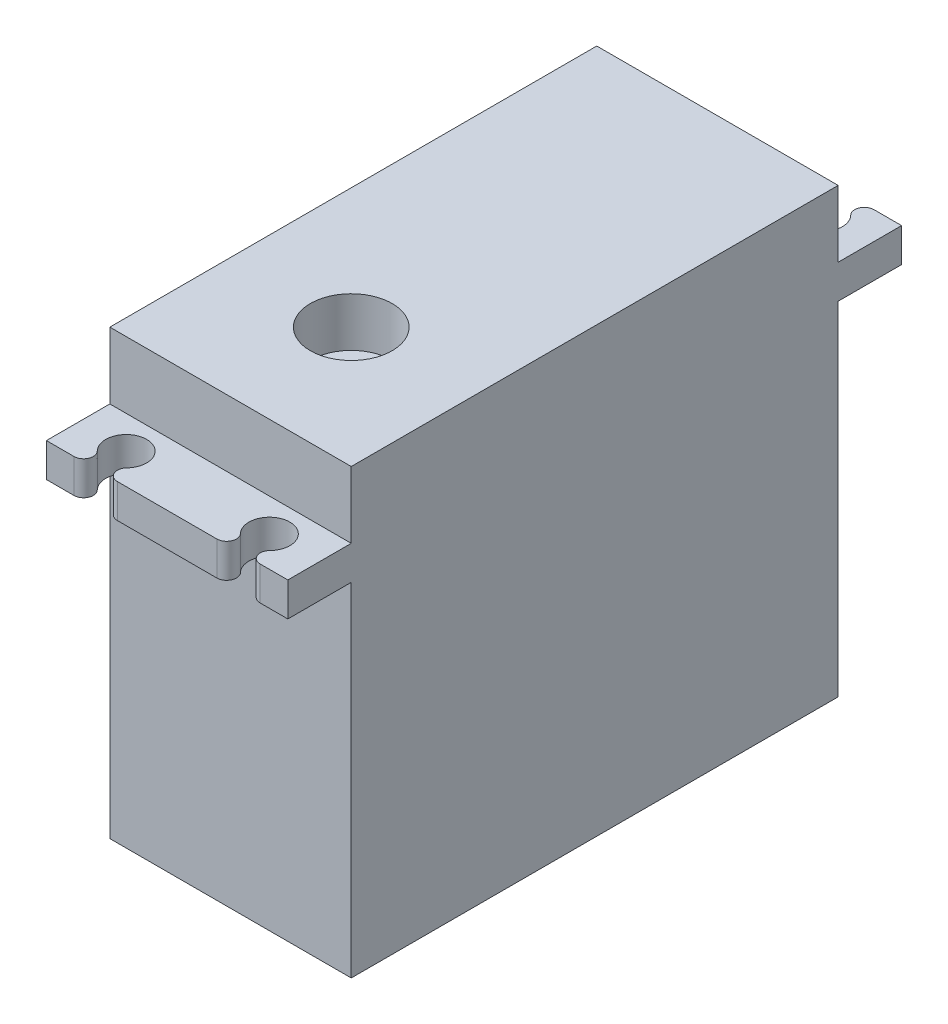
ISO-10303-21;
HEADER;
FILE_DESCRIPTION(('STEP AP214'),'2;1');
FILE_NAME('part.step','',(''),(''),'','','');
FILE_SCHEMA(('AUTOMOTIVE_DESIGN { 1 0 10303 214 1 1 1 1 }'));
ENDSEC;
DATA;
#1=APPLICATION_CONTEXT('core data for automotive mechanical design processes');
#2=APPLICATION_PROTOCOL_DEFINITION('international standard','automotive_design',2000,#1);
#3=PRODUCT_CONTEXT('',#1,'mechanical');
#4=PRODUCT('Part','Part','',(#3));
#5=PRODUCT_RELATED_PRODUCT_CATEGORY('part','',(#4));
#6=PRODUCT_DEFINITION_FORMATION('','',#4);
#7=PRODUCT_DEFINITION_CONTEXT('part definition',#1,'design');
#8=PRODUCT_DEFINITION('design','',#6,#7);
#9=PRODUCT_DEFINITION_SHAPE('','',#8);
#10=(LENGTH_UNIT() NAMED_UNIT(*) SI_UNIT(.MILLI.,.METRE.));
#11=(NAMED_UNIT(*) PLANE_ANGLE_UNIT() SI_UNIT($,.RADIAN.));
#12=(NAMED_UNIT(*) SI_UNIT($,.STERADIAN.) SOLID_ANGLE_UNIT());
#13=UNCERTAINTY_MEASURE_WITH_UNIT(LENGTH_MEASURE(1.E-05),#10,'distance_accuracy_value','');
#14=(GEOMETRIC_REPRESENTATION_CONTEXT(3) GLOBAL_UNCERTAINTY_ASSIGNED_CONTEXT((#13)) GLOBAL_UNIT_ASSIGNED_CONTEXT((#10,
#11,#12)) REPRESENTATION_CONTEXT('',''));
#15=CARTESIAN_POINT('',(0.,0.,0.));
#16=DIRECTION('',(0.,0.,1.));
#17=DIRECTION('',(1.,0.,0.));
#18=AXIS2_PLACEMENT_3D('',#15,#16,#17);
#19=CARTESIAN_POINT('',(0.,0.,-37.5));
#20=DIRECTION('',(0.,0.,1.));
#21=DIRECTION('',(-1.,0.,0.));
#22=AXIS2_PLACEMENT_3D('',#19,#20,#21);
#23=PLANE('',#22);
#24=DIRECTION('',(0.,1.,0.));
#25=VECTOR('',#24,1.);
#26=CARTESIAN_POINT('',(-11.3759671582877,-0.00102500000000172,-37.5));
#27=LINE('',#26,#25);
#28=CARTESIAN_POINT('',(-11.3759671582877,41.87,-37.5));
#29=VERTEX_POINT('',#28);
#30=CARTESIAN_POINT('',(-11.3759671582877,46.,-37.5));
#31=VERTEX_POINT('',#30);
#32=EDGE_CURVE('E239',#29,#31,#27,.T.);
#33=ORIENTED_EDGE('',*,*,#32,.F.);
#34=DIRECTION('',(1.,0.,0.));
#35=VECTOR('',#34,1.);
#36=CARTESIAN_POINT('',(-14.75,41.87,-37.5));
#37=LINE('',#36,#35);
#38=CARTESIAN_POINT('',(-14.75,41.87,-37.5));
#39=VERTEX_POINT('',#38);
#40=EDGE_CURVE('E244',#39,#29,#37,.T.);
#41=ORIENTED_EDGE('',*,*,#40,.F.);
#42=DIRECTION('',(0.,1.,0.));
#43=VECTOR('',#42,1.);
#44=CARTESIAN_POINT('',(-14.75,41.87,-37.5));
#45=LINE('',#44,#43);
#46=CARTESIAN_POINT('',(-14.75,46.,-37.5));
#47=VERTEX_POINT('',#46);
#48=EDGE_CURVE('E285',#39,#47,#45,.T.);
#49=ORIENTED_EDGE('',*,*,#48,.T.);
#50=DIRECTION('',(1.,0.,0.));
#51=VECTOR('',#50,1.);
#52=CARTESIAN_POINT('',(-14.75,46.,-37.5));
#53=LINE('',#52,#51);
#54=EDGE_CURVE('E296',#47,#31,#53,.T.);
#55=ORIENTED_EDGE('',*,*,#54,.T.);
#56=EDGE_LOOP('',(#33,#41,#49,#55));
#57=FACE_BOUND('',#56,.T.);
#58=ADVANCED_FACE('F35',(#57),#23,.F.);
#59=CARTESIAN_POINT('',(-6.079499649266,41.87,-37.5));
#60=VERTEX_POINT('',#59);
#61=CARTESIAN_POINT('',(6.079499649266,41.87,-37.5));
#62=VERTEX_POINT('',#61);
#63=EDGE_CURVE('E292',#60,#62,#37,.T.);
#64=ORIENTED_EDGE('',*,*,#63,.F.);
#65=DIRECTION('',(0.,1.,0.));
#66=VECTOR('',#65,1.);
#67=CARTESIAN_POINT('',(-6.079499649266,-0.00102500000000172,-37.5));
#68=LINE('',#67,#66);
#69=CARTESIAN_POINT('',(-6.079499649266,46.,-37.5));
#70=VERTEX_POINT('',#69);
#71=EDGE_CURVE('E256',#60,#70,#68,.T.);
#72=ORIENTED_EDGE('',*,*,#71,.T.);
#73=CARTESIAN_POINT('',(6.079499649266,46.,-37.5));
#74=VERTEX_POINT('',#73);
#75=EDGE_CURVE('E300',#70,#74,#53,.T.);
#76=ORIENTED_EDGE('',*,*,#75,.T.);
#77=DIRECTION('',(0.,1.,0.));
#78=VECTOR('',#77,1.);
#79=CARTESIAN_POINT('',(6.079499649266,-0.00102500000000172,-37.5));
#80=LINE('',#79,#78);
#81=EDGE_CURVE('E273',#62,#74,#80,.T.);
#82=ORIENTED_EDGE('',*,*,#81,.F.);
#83=EDGE_LOOP('',(#64,#72,#76,#82));
#84=FACE_BOUND('',#83,.T.);
#85=ADVANCED_FACE('F552',(#84),#23,.F.);
#86=CARTESIAN_POINT('',(-14.75,54.13,-29.75));
#87=DIRECTION('',(0.,0.,1.));
#88=DIRECTION('',(1.,0.,0.));
#89=AXIS2_PLACEMENT_3D('',#86,#87,#88);
#90=PLANE('',#89);
#91=DIRECTION('',(1.,0.,0.));
#92=VECTOR('',#91,1.);
#93=CARTESIAN_POINT('',(-14.75,46.,-29.75));
#94=LINE('',#93,#92);
#95=CARTESIAN_POINT('',(-14.75,46.,-29.75));
#96=VERTEX_POINT('',#95);
#97=CARTESIAN_POINT('',(14.75,46.,-29.75));
#98=VERTEX_POINT('',#97);
#99=EDGE_CURVE('E289',#96,#98,#94,.T.);
#100=ORIENTED_EDGE('',*,*,#99,.F.);
#101=DIRECTION('',(0.,-1.,0.));
#102=VECTOR('',#101,1.);
#103=CARTESIAN_POINT('',(-14.75,54.13,-29.75));
#104=LINE('',#103,#102);
#105=CARTESIAN_POINT('',(-14.75,54.13,-29.75));
#106=VERTEX_POINT('',#105);
#107=EDGE_CURVE('E331',#106,#96,#104,.T.);
#108=ORIENTED_EDGE('',*,*,#107,.F.);
#109=DIRECTION('',(-1.,0.,0.));
#110=VECTOR('',#109,1.);
#111=CARTESIAN_POINT('',(-14.75,54.13,-29.75));
#112=LINE('',#111,#110);
#113=CARTESIAN_POINT('',(14.75,54.13,-29.75));
#114=VERTEX_POINT('',#113);
#115=EDGE_CURVE('E383',#114,#106,#112,.T.);
#116=ORIENTED_EDGE('',*,*,#115,.F.);
#117=DIRECTION('',(0.,-1.,0.));
#118=VECTOR('',#117,1.);
#119=CARTESIAN_POINT('',(14.75,54.13,-29.75));
#120=LINE('',#119,#118);
#121=EDGE_CURVE('E11',#114,#98,#120,.T.);
#122=ORIENTED_EDGE('',*,*,#121,.T.);
#123=EDGE_LOOP('',(#100,#108,#116,#122));
#124=FACE_BOUND('',#123,.T.);
#125=ADVANCED_FACE('F559',(#124),#90,.F.);
#126=CARTESIAN_POINT('',(0.,0.,37.5));
#127=DIRECTION('',(0.,0.,-1.));
#128=DIRECTION('',(-1.,0.,0.));
#129=AXIS2_PLACEMENT_3D('',#126,#127,#128);
#130=PLANE('',#129);
#131=DIRECTION('',(0.,1.,0.));
#132=VECTOR('',#131,1.);
#133=CARTESIAN_POINT('',(-11.3759671582877,-0.00102500000000172,37.5));
#134=LINE('',#133,#132);
#135=CARTESIAN_POINT('',(-11.3759671582877,41.87,37.5));
#136=VERTEX_POINT('',#135);
#137=CARTESIAN_POINT('',(-11.3759671582877,46.,37.5));
#138=VERTEX_POINT('',#137);
#139=EDGE_CURVE('E472',#136,#138,#134,.T.);
#140=ORIENTED_EDGE('',*,*,#139,.T.);
#141=DIRECTION('',(1.,0.,0.));
#142=VECTOR('',#141,1.);
#143=CARTESIAN_POINT('',(-14.75,46.,37.5));
#144=LINE('',#143,#142);
#145=CARTESIAN_POINT('',(-14.75,46.,37.5));
#146=VERTEX_POINT('',#145);
#147=EDGE_CURVE('E442',#146,#138,#144,.T.);
#148=ORIENTED_EDGE('',*,*,#147,.F.);
#149=DIRECTION('',(0.,1.,0.));
#150=VECTOR('',#149,1.);
#151=CARTESIAN_POINT('',(-14.75,41.87,37.5));
#152=LINE('',#151,#150);
#153=CARTESIAN_POINT('',(-14.75,41.87,37.5));
#154=VERTEX_POINT('',#153);
#155=EDGE_CURVE('E412',#154,#146,#152,.T.);
#156=ORIENTED_EDGE('',*,*,#155,.F.);
#157=DIRECTION('',(1.,0.,0.));
#158=VECTOR('',#157,1.);
#159=CARTESIAN_POINT('',(-14.75,41.87,37.5));
#160=LINE('',#159,#158);
#161=EDGE_CURVE('E429',#154,#136,#160,.T.);
#162=ORIENTED_EDGE('',*,*,#161,.T.);
#163=EDGE_LOOP('',(#140,#148,#156,#162));
#164=FACE_BOUND('',#163,.T.);
#165=ADVANCED_FACE('F535',(#164),#130,.F.);
#166=CARTESIAN_POINT('',(-6.079499649266,46.,37.5));
#167=VERTEX_POINT('',#166);
#168=CARTESIAN_POINT('',(6.079499649266,46.,37.5));
#169=VERTEX_POINT('',#168);
#170=EDGE_CURVE('E444',#167,#169,#144,.T.);
#171=ORIENTED_EDGE('',*,*,#170,.F.);
#172=DIRECTION('',(0.,1.,0.));
#173=VECTOR('',#172,1.);
#174=CARTESIAN_POINT('',(-6.079499649266,-0.00102500000000172,37.5));
#175=LINE('',#174,#173);
#176=CARTESIAN_POINT('',(-6.079499649266,41.87,37.5));
#177=VERTEX_POINT('',#176);
#178=EDGE_CURVE('E475',#177,#167,#175,.T.);
#179=ORIENTED_EDGE('',*,*,#178,.F.);
#180=CARTESIAN_POINT('',(6.079499649266,41.87,37.5));
#181=VERTEX_POINT('',#180);
#182=EDGE_CURVE('E437',#177,#181,#160,.T.);
#183=ORIENTED_EDGE('',*,*,#182,.T.);
#184=DIRECTION('',(0.,1.,0.));
#185=VECTOR('',#184,1.);
#186=CARTESIAN_POINT('',(6.079499649266,-0.00102500000000172,37.5));
#187=LINE('',#186,#185);
#188=EDGE_CURVE('E446',#181,#169,#187,.T.);
#189=ORIENTED_EDGE('',*,*,#188,.T.);
#190=EDGE_LOOP('',(#171,#179,#183,#189));
#191=FACE_BOUND('',#190,.T.);
#192=ADVANCED_FACE('F501',(#191),#130,.F.);
#193=CARTESIAN_POINT('',(-14.75,54.13,29.75));
#194=DIRECTION('',(0.,0.,-1.));
#195=DIRECTION('',(-1.,0.,0.));
#196=AXIS2_PLACEMENT_3D('',#193,#194,#195);
#197=PLANE('',#196);
#198=DIRECTION('',(1.,0.,0.));
#199=VECTOR('',#198,1.);
#200=CARTESIAN_POINT('',(-14.75,41.87,29.75));
#201=LINE('',#200,#199);
#202=CARTESIAN_POINT('',(-14.75,41.87,29.75));
#203=VERTEX_POINT('',#202);
#204=CARTESIAN_POINT('',(14.75,41.87,29.75));
#205=VERTEX_POINT('',#204);
#206=EDGE_CURVE('E369',#203,#205,#201,.T.);
#207=ORIENTED_EDGE('',*,*,#206,.F.);
#208=DIRECTION('',(0.,-1.,0.));
#209=VECTOR('',#208,1.);
#210=CARTESIAN_POINT('',(-14.75,54.13,29.75));
#211=LINE('',#210,#209);
#212=CARTESIAN_POINT('',(-14.75,0.,29.75));
#213=VERTEX_POINT('',#212);
#214=EDGE_CURVE('E343',#203,#213,#211,.T.);
#215=ORIENTED_EDGE('',*,*,#214,.T.);
#216=DIRECTION('',(1.,0.,0.));
#217=VECTOR('',#216,1.);
#218=CARTESIAN_POINT('',(-14.75,0.,29.75));
#219=LINE('',#218,#217);
#220=CARTESIAN_POINT('',(14.75,0.,29.75));
#221=VERTEX_POINT('',#220);
#222=EDGE_CURVE('E348',#213,#221,#219,.T.);
#223=ORIENTED_EDGE('',*,*,#222,.T.);
#224=DIRECTION('',(0.,-1.,0.));
#225=VECTOR('',#224,1.);
#226=CARTESIAN_POINT('',(14.75,54.13,29.75));
#227=LINE('',#226,#225);
#228=EDGE_CURVE('E344',#205,#221,#227,.T.);
#229=ORIENTED_EDGE('',*,*,#228,.F.);
#230=EDGE_LOOP('',(#207,#215,#223,#229));
#231=FACE_BOUND('',#230,.T.);
#232=ADVANCED_FACE('F365',(#231),#197,.F.);
#233=CARTESIAN_POINT('',(14.75,54.13,29.75));
#234=DIRECTION('',(-1.,0.,0.));
#235=DIRECTION('',(0.,0.,1.));
#236=AXIS2_PLACEMENT_3D('',#233,#234,#235);
#237=PLANE('',#236);
#238=DIRECTION('',(0.,0.,-1.));
#239=VECTOR('',#238,1.);
#240=CARTESIAN_POINT('',(14.75,0.,29.75));
#241=LINE('',#240,#239);
#242=CARTESIAN_POINT('',(14.75,0.,-29.75));
#243=VERTEX_POINT('',#242);
#244=EDGE_CURVE('E380',#221,#243,#241,.T.);
#245=ORIENTED_EDGE('',*,*,#244,.T.);
#246=CARTESIAN_POINT('',(14.75,41.87,-29.75));
#247=VERTEX_POINT('',#246);
#248=EDGE_CURVE('E44',#247,#243,#120,.T.);
#249=ORIENTED_EDGE('',*,*,#248,.F.);
#250=DIRECTION('',(0.,0.,1.));
#251=VECTOR('',#250,1.);
#252=CARTESIAN_POINT('',(14.75,41.87,-37.5));
#253=LINE('',#252,#251);
#254=CARTESIAN_POINT('',(14.75,41.87,-37.5));
#255=VERTEX_POINT('',#254);
#256=EDGE_CURVE('E309',#255,#247,#253,.T.);
#257=ORIENTED_EDGE('',*,*,#256,.F.);
#258=DIRECTION('',(0.,1.,0.));
#259=VECTOR('',#258,1.);
#260=CARTESIAN_POINT('',(14.75,41.87,-37.5));
#261=LINE('',#260,#259);
#262=CARTESIAN_POINT('',(14.75,46.,-37.5));
#263=VERTEX_POINT('',#262);
#264=EDGE_CURVE('E291',#255,#263,#261,.T.);
#265=ORIENTED_EDGE('',*,*,#264,.T.);
#266=DIRECTION('',(0.,0.,1.));
#267=VECTOR('',#266,1.);
#268=CARTESIAN_POINT('',(14.75,46.,-37.5));
#269=LINE('',#268,#267);
#270=EDGE_CURVE('E311',#263,#98,#269,.T.);
#271=ORIENTED_EDGE('',*,*,#270,.T.);
#272=ORIENTED_EDGE('',*,*,#121,.F.);
#273=DIRECTION('',(0.,0.,-1.));
#274=VECTOR('',#273,1.);
#275=CARTESIAN_POINT('',(14.75,54.13,29.75));
#276=LINE('',#275,#274);
#277=CARTESIAN_POINT('',(14.75,54.13,29.75));
#278=VERTEX_POINT('',#277);
#279=EDGE_CURVE('E381',#278,#114,#276,.T.);
#280=ORIENTED_EDGE('',*,*,#279,.F.);
#281=CARTESIAN_POINT('',(14.75,46.,29.75));
#282=VERTEX_POINT('',#281);
#283=EDGE_CURVE('E338',#278,#282,#227,.T.);
#284=ORIENTED_EDGE('',*,*,#283,.T.);
#285=DIRECTION('',(0.,0.,-1.));
#286=VECTOR('',#285,1.);
#287=CARTESIAN_POINT('',(14.75,46.,37.5));
#288=LINE('',#287,#286);
#289=CARTESIAN_POINT('',(14.75,46.,37.5));
#290=VERTEX_POINT('',#289);
#291=EDGE_CURVE('E421',#290,#282,#288,.T.);
#292=ORIENTED_EDGE('',*,*,#291,.F.);
#293=DIRECTION('',(0.,1.,0.));
#294=VECTOR('',#293,1.);
#295=CARTESIAN_POINT('',(14.75,41.87,37.5));
#296=LINE('',#295,#294);
#297=CARTESIAN_POINT('',(14.75,41.87,37.5));
#298=VERTEX_POINT('',#297);
#299=EDGE_CURVE('E439',#298,#290,#296,.T.);
#300=ORIENTED_EDGE('',*,*,#299,.F.);
#301=DIRECTION('',(0.,0.,-1.));
#302=VECTOR('',#301,1.);
#303=CARTESIAN_POINT('',(14.75,41.87,37.5));
#304=LINE('',#303,#302);
#305=EDGE_CURVE('E406',#298,#205,#304,.T.);
#306=ORIENTED_EDGE('',*,*,#305,.T.);
#307=ORIENTED_EDGE('',*,*,#228,.T.);
#308=EDGE_LOOP('',(#245,#249,#257,#265,#271,#272,#280,#284,#292,#300,#306,#307));
#309=FACE_BOUND('',#308,.T.);
#310=ADVANCED_FACE('F37',(#309),#237,.F.);
#311=CARTESIAN_POINT('',(-14.75,41.87,-29.75));
#312=VERTEX_POINT('',#311);
#313=CARTESIAN_POINT('',(-14.75,0.,-29.75));
#314=VERTEX_POINT('',#313);
#315=EDGE_CURVE('E356',#312,#314,#104,.T.);
#316=ORIENTED_EDGE('',*,*,#315,.F.);
#317=DIRECTION('',(1.,0.,0.));
#318=VECTOR('',#317,1.);
#319=CARTESIAN_POINT('',(-14.75,41.87,-29.75));
#320=LINE('',#319,#318);
#321=EDGE_CURVE('E284',#312,#247,#320,.T.);
#322=ORIENTED_EDGE('',*,*,#321,.T.);
#323=ORIENTED_EDGE('',*,*,#248,.T.);
#324=DIRECTION('',(-1.,0.,0.));
#325=VECTOR('',#324,1.);
#326=CARTESIAN_POINT('',(-14.75,0.,-29.75));
#327=LINE('',#326,#325);
#328=EDGE_CURVE('E377',#243,#314,#327,.T.);
#329=ORIENTED_EDGE('',*,*,#328,.T.);
#330=EDGE_LOOP('',(#316,#322,#323,#329));
#331=FACE_BOUND('',#330,.T.);
#332=ADVANCED_FACE('F400',(#331),#90,.F.);
#333=CARTESIAN_POINT('',(-14.75,54.13,29.75));
#334=DIRECTION('',(1.,0.,0.));
#335=DIRECTION('',(0.,0.,-1.));
#336=AXIS2_PLACEMENT_3D('',#333,#334,#335);
#337=PLANE('',#336);
#338=DIRECTION('',(0.,0.,1.));
#339=VECTOR('',#338,1.);
#340=CARTESIAN_POINT('',(-14.75,0.,29.75));
#341=LINE('',#340,#339);
#342=EDGE_CURVE('E372',#314,#213,#341,.T.);
#343=ORIENTED_EDGE('',*,*,#342,.T.);
#344=ORIENTED_EDGE('',*,*,#214,.F.);
#345=DIRECTION('',(0.,0.,-1.));
#346=VECTOR('',#345,1.);
#347=CARTESIAN_POINT('',(-14.75,41.87,37.5));
#348=LINE('',#347,#346);
#349=EDGE_CURVE('E398',#154,#203,#348,.T.);
#350=ORIENTED_EDGE('',*,*,#349,.F.);
#351=ORIENTED_EDGE('',*,*,#155,.T.);
#352=DIRECTION('',(0.,0.,-1.));
#353=VECTOR('',#352,1.);
#354=CARTESIAN_POINT('',(-14.75,46.,37.5));
#355=LINE('',#354,#353);
#356=CARTESIAN_POINT('',(-14.75,46.,29.75));
#357=VERTEX_POINT('',#356);
#358=EDGE_CURVE('E427',#146,#357,#355,.T.);
#359=ORIENTED_EDGE('',*,*,#358,.T.);
#360=CARTESIAN_POINT('',(-14.75,54.13,29.75));
#361=VERTEX_POINT('',#360);
#362=EDGE_CURVE('E355',#361,#357,#211,.T.);
#363=ORIENTED_EDGE('',*,*,#362,.F.);
#364=DIRECTION('',(0.,0.,1.));
#365=VECTOR('',#364,1.);
#366=CARTESIAN_POINT('',(-14.75,54.13,29.75));
#367=LINE('',#366,#365);
#368=EDGE_CURVE('E388',#106,#361,#367,.T.);
#369=ORIENTED_EDGE('',*,*,#368,.F.);
#370=ORIENTED_EDGE('',*,*,#107,.T.);
#371=DIRECTION('',(0.,0.,1.));
#372=VECTOR('',#371,1.);
#373=CARTESIAN_POINT('',(-14.75,46.,-37.5));
#374=LINE('',#373,#372);
#375=EDGE_CURVE('E315',#47,#96,#374,.T.);
#376=ORIENTED_EDGE('',*,*,#375,.F.);
#377=ORIENTED_EDGE('',*,*,#48,.F.);
#378=DIRECTION('',(0.,0.,1.));
#379=VECTOR('',#378,1.);
#380=CARTESIAN_POINT('',(-14.75,41.87,-37.5));
#381=LINE('',#380,#379);
#382=EDGE_CURVE('E299',#39,#312,#381,.T.);
#383=ORIENTED_EDGE('',*,*,#382,.T.);
#384=ORIENTED_EDGE('',*,*,#315,.T.);
#385=EDGE_LOOP('',(#343,#344,#350,#351,#359,#363,#369,#370,#376,#377,#383,#384));
#386=FACE_BOUND('',#385,.T.);
#387=ADVANCED_FACE('F373',(#386),#337,.F.);
#388=ORIENTED_EDGE('',*,*,#362,.T.);
#389=DIRECTION('',(1.,0.,0.));
#390=VECTOR('',#389,1.);
#391=CARTESIAN_POINT('',(-14.75,46.,29.75));
#392=LINE('',#391,#390);
#393=EDGE_CURVE('E413',#357,#282,#392,.T.);
#394=ORIENTED_EDGE('',*,*,#393,.T.);
#395=ORIENTED_EDGE('',*,*,#283,.F.);
#396=DIRECTION('',(1.,0.,0.));
#397=VECTOR('',#396,1.);
#398=CARTESIAN_POINT('',(-14.75,54.13,29.75));
#399=LINE('',#398,#397);
#400=EDGE_CURVE('E395',#361,#278,#399,.T.);
#401=ORIENTED_EDGE('',*,*,#400,.F.);
#402=EDGE_LOOP('',(#388,#394,#395,#401));
#403=FACE_BOUND('',#402,.T.);
#404=ADVANCED_FACE('F527',(#403),#197,.F.);
#405=CARTESIAN_POINT('',(0.,54.13,0.));
#406=DIRECTION('',(0.,-1.,0.));
#407=DIRECTION('',(0.,0.,-1.));
#408=AXIS2_PLACEMENT_3D('',#405,#406,#407);
#409=PLANE('',#408);
#410=CARTESIAN_POINT('',(0.,54.13,15.));
#411=DIRECTION('',(0.,1.,0.));
#412=DIRECTION('',(0.,0.,1.));
#413=AXIS2_PLACEMENT_3D('',#410,#411,#412);
#414=CIRCLE('',#413,5.);
#415=CARTESIAN_POINT('',(0.,54.13,20.));
#416=VERTEX_POINT('',#415);
#417=EDGE_CURVE('E661',#416,#416,#414,.T.);
#418=ORIENTED_EDGE('',*,*,#417,.F.);
#419=EDGE_LOOP('',(#418));
#420=FACE_BOUND('',#419,.T.);
#421=ORIENTED_EDGE('',*,*,#279,.T.);
#422=ORIENTED_EDGE('',*,*,#115,.T.);
#423=ORIENTED_EDGE('',*,*,#368,.T.);
#424=ORIENTED_EDGE('',*,*,#400,.T.);
#425=EDGE_LOOP('',(#421,#422,#423,#424));
#426=FACE_BOUND('',#425,.T.);
#427=ADVANCED_FACE('F528',(#420,#426),#409,.F.);
#428=CARTESIAN_POINT('',(0.,0.,0.));
#429=DIRECTION('',(0.,-1.,0.));
#430=DIRECTION('',(0.,0.,-1.));
#431=AXIS2_PLACEMENT_3D('',#428,#429,#430);
#432=PLANE('',#431);
#433=ORIENTED_EDGE('',*,*,#244,.F.);
#434=ORIENTED_EDGE('',*,*,#222,.F.);
#435=ORIENTED_EDGE('',*,*,#342,.F.);
#436=ORIENTED_EDGE('',*,*,#328,.F.);
#437=EDGE_LOOP('',(#433,#434,#435,#436));
#438=FACE_BOUND('',#437,.T.);
#439=ADVANCED_FACE('F378',(#438),#432,.T.);
#440=CARTESIAN_POINT('',(-14.75,41.87,37.5));
#441=DIRECTION('',(0.,1.,0.));
#442=DIRECTION('',(0.,0.,1.));
#443=AXIS2_PLACEMENT_3D('',#440,#441,#442);
#444=PLANE('',#443);
#445=CARTESIAN_POINT('',(-8.75,41.87,33.75));
#446=DIRECTION('',(0.,1.,0.));
#447=DIRECTION('',(0.,0.,1.));
#448=AXIS2_PLACEMENT_3D('',#445,#446,#447);
#449=CIRCLE('',#448,2.5);
#450=CARTESIAN_POINT('',(-10.5355674812702,41.87,35.4997853496445));
#451=VERTEX_POINT('',#450);
#452=CARTESIAN_POINT('',(-6.94342326570085,41.87,35.4780857915882));
#453=VERTEX_POINT('',#452);
#454=EDGE_CURVE('E491',#451,#453,#449,.F.);
#455=ORIENTED_EDGE('',*,*,#454,.F.);
#456=CARTESIAN_POINT('',(-11.3759671582877,41.87,36.3233437186875));
#457=DIRECTION('',(0.,1.,0.));
#458=DIRECTION('',(0.,0.,1.));
#459=AXIS2_PLACEMENT_3D('',#456,#457,#458);
#460=CIRCLE('',#459,1.17665628131247);
#461=EDGE_CURVE('E488',#136,#451,#460,.T.);
#462=ORIENTED_EDGE('',*,*,#461,.F.);
#463=ORIENTED_EDGE('',*,*,#161,.F.);
#464=ORIENTED_EDGE('',*,*,#349,.T.);
#465=ORIENTED_EDGE('',*,*,#206,.T.);
#466=ORIENTED_EDGE('',*,*,#305,.F.);
#467=CARTESIAN_POINT('',(11.3759671582877,41.87,37.5));
#468=VERTEX_POINT('',#467);
#469=EDGE_CURVE('E438',#468,#298,#160,.T.);
#470=ORIENTED_EDGE('',*,*,#469,.F.);
#471=CARTESIAN_POINT('',(11.3759671582877,41.87,36.3233437186875));
#472=DIRECTION('',(0.,1.,0.));
#473=DIRECTION('',(0.,0.,1.));
#474=AXIS2_PLACEMENT_3D('',#471,#472,#473);
#475=CIRCLE('',#474,1.17665628131247);
#476=CARTESIAN_POINT('',(10.5355674812702,41.87,35.4997853496445));
#477=VERTEX_POINT('',#476);
#478=EDGE_CURVE('E469',#477,#468,#475,.T.);
#479=ORIENTED_EDGE('',*,*,#478,.F.);
#480=CARTESIAN_POINT('',(8.75,41.87,33.75));
#481=DIRECTION('',(0.,1.,0.));
#482=DIRECTION('',(0.,0.,1.));
#483=AXIS2_PLACEMENT_3D('',#480,#481,#482);
#484=CIRCLE('',#483,2.5);
#485=CARTESIAN_POINT('',(6.94342326570085,41.87,35.4780857915882));
#486=VERTEX_POINT('',#485);
#487=EDGE_CURVE('E466',#486,#477,#484,.F.);
#488=ORIENTED_EDGE('',*,*,#487,.F.);
#489=CARTESIAN_POINT('',(6.079499649266,41.87,36.3044742301384));
#490=DIRECTION('',(0.,1.,0.));
#491=DIRECTION('',(0.,0.,1.));
#492=AXIS2_PLACEMENT_3D('',#489,#490,#491);
#493=CIRCLE('',#492,1.19552576986162);
#494=EDGE_CURVE('E463',#181,#486,#493,.T.);
#495=ORIENTED_EDGE('',*,*,#494,.F.);
#496=ORIENTED_EDGE('',*,*,#182,.F.);
#497=CARTESIAN_POINT('',(-6.079499649266,41.87,36.3044742301384));
#498=DIRECTION('',(0.,1.,0.));
#499=DIRECTION('',(0.,0.,1.));
#500=AXIS2_PLACEMENT_3D('',#497,#498,#499);
#501=CIRCLE('',#500,1.19552576986162);
#502=EDGE_CURVE('E325',#453,#177,#501,.T.);
#503=ORIENTED_EDGE('',*,*,#502,.F.);
#504=EDGE_LOOP('',(#455,#462,#463,#464,#465,#466,#470,#479,#488,#495,#496,#503));
#505=FACE_BOUND('',#504,.T.);
#506=ADVANCED_FACE('F409',(#505),#444,.F.);
#507=CARTESIAN_POINT('',(-14.75,46.,37.5));
#508=DIRECTION('',(0.,1.,0.));
#509=DIRECTION('',(0.,0.,1.));
#510=AXIS2_PLACEMENT_3D('',#507,#508,#509);
#511=PLANE('',#510);
#512=CARTESIAN_POINT('',(-11.3759671582877,46.,36.3233437186875));
#513=DIRECTION('',(0.,-1.,0.));
#514=DIRECTION('',(0.,0.,-1.));
#515=AXIS2_PLACEMENT_3D('',#512,#513,#514);
#516=CIRCLE('',#515,1.17665628131247);
#517=CARTESIAN_POINT('',(-10.5355674812702,46.,35.4997853496445));
#518=VERTEX_POINT('',#517);
#519=EDGE_CURVE('E486',#518,#138,#516,.T.);
#520=ORIENTED_EDGE('',*,*,#519,.F.);
#521=CARTESIAN_POINT('',(-8.75,46.,33.75));
#522=DIRECTION('',(0.,1.,0.));
#523=DIRECTION('',(0.,0.,-1.));
#524=AXIS2_PLACEMENT_3D('',#521,#522,#523);
#525=CIRCLE('',#524,2.5);
#526=CARTESIAN_POINT('',(-6.94342326570085,46.,35.4780857915882));
#527=VERTEX_POINT('',#526);
#528=EDGE_CURVE('E476',#527,#518,#525,.T.);
#529=ORIENTED_EDGE('',*,*,#528,.F.);
#530=CARTESIAN_POINT('',(-6.079499649266,46.,36.3044742301384));
#531=DIRECTION('',(0.,-1.,0.));
#532=DIRECTION('',(0.,0.,-1.));
#533=AXIS2_PLACEMENT_3D('',#530,#531,#532);
#534=CIRCLE('',#533,1.19552576986162);
#535=EDGE_CURVE('E483',#167,#527,#534,.T.);
#536=ORIENTED_EDGE('',*,*,#535,.F.);
#537=ORIENTED_EDGE('',*,*,#170,.T.);
#538=CARTESIAN_POINT('',(6.079499649266,46.,36.3044742301384));
#539=DIRECTION('',(0.,-1.,0.));
#540=DIRECTION('',(0.,0.,1.));
#541=AXIS2_PLACEMENT_3D('',#538,#539,#540);
#542=CIRCLE('',#541,1.19552576986162);
#543=CARTESIAN_POINT('',(6.94342326570085,46.,35.4780857915882));
#544=VERTEX_POINT('',#543);
#545=EDGE_CURVE('E460',#544,#169,#542,.T.);
#546=ORIENTED_EDGE('',*,*,#545,.F.);
#547=CARTESIAN_POINT('',(8.75,46.,33.75));
#548=DIRECTION('',(0.,1.,0.));
#549=DIRECTION('',(0.,0.,1.));
#550=AXIS2_PLACEMENT_3D('',#547,#548,#549);
#551=CIRCLE('',#550,2.5);
#552=CARTESIAN_POINT('',(10.5355674812702,46.,35.4997853496445));
#553=VERTEX_POINT('',#552);
#554=EDGE_CURVE('E450',#553,#544,#551,.T.);
#555=ORIENTED_EDGE('',*,*,#554,.F.);
#556=CARTESIAN_POINT('',(11.3759671582877,46.,36.3233437186875));
#557=DIRECTION('',(0.,-1.,0.));
#558=DIRECTION('',(0.,0.,1.));
#559=AXIS2_PLACEMENT_3D('',#556,#557,#558);
#560=CIRCLE('',#559,1.17665628131247);
#561=CARTESIAN_POINT('',(11.3759671582877,46.,37.5));
#562=VERTEX_POINT('',#561);
#563=EDGE_CURVE('E457',#562,#553,#560,.T.);
#564=ORIENTED_EDGE('',*,*,#563,.F.);
#565=EDGE_CURVE('E415',#562,#290,#144,.T.);
#566=ORIENTED_EDGE('',*,*,#565,.T.);
#567=ORIENTED_EDGE('',*,*,#291,.T.);
#568=ORIENTED_EDGE('',*,*,#393,.F.);
#569=ORIENTED_EDGE('',*,*,#358,.F.);
#570=ORIENTED_EDGE('',*,*,#147,.T.);
#571=EDGE_LOOP('',(#520,#529,#536,#537,#546,#555,#564,#566,#567,#568,#569,#570));
#572=FACE_BOUND('',#571,.T.);
#573=ADVANCED_FACE('F522',(#572),#511,.T.);
#574=ORIENTED_EDGE('',*,*,#565,.F.);
#575=DIRECTION('',(0.,1.,0.));
#576=VECTOR('',#575,1.);
#577=CARTESIAN_POINT('',(11.3759671582877,-0.00102500000000172,37.5));
#578=LINE('',#577,#576);
#579=EDGE_CURVE('E449',#468,#562,#578,.T.);
#580=ORIENTED_EDGE('',*,*,#579,.F.);
#581=ORIENTED_EDGE('',*,*,#469,.T.);
#582=ORIENTED_EDGE('',*,*,#299,.T.);
#583=EDGE_LOOP('',(#574,#580,#581,#582));
#584=FACE_BOUND('',#583,.T.);
#585=ADVANCED_FACE('F508',(#584),#130,.F.);
#586=CARTESIAN_POINT('',(6.079499649266,-0.00102500000000172,36.3044742301384));
#587=DIRECTION('',(0.,1.,0.));
#588=DIRECTION('',(0.,0.,1.));
#589=AXIS2_PLACEMENT_3D('',#586,#587,#588);
#590=CYLINDRICAL_SURFACE('',#589,1.19552576986162);
#591=ORIENTED_EDGE('',*,*,#494,.T.);
#592=DIRECTION('',(0.,1.,0.));
#593=VECTOR('',#592,1.);
#594=CARTESIAN_POINT('',(6.94342326570085,-0.00102500000000172,35.4780857915882));
#595=LINE('',#594,#593);
#596=EDGE_CURVE('E417',#486,#544,#595,.T.);
#597=ORIENTED_EDGE('',*,*,#596,.T.);
#598=ORIENTED_EDGE('',*,*,#545,.T.);
#599=ORIENTED_EDGE('',*,*,#188,.F.);
#600=EDGE_LOOP('',(#591,#597,#598,#599));
#601=FACE_BOUND('',#600,.T.);
#602=ADVANCED_FACE('F519',(#601),#590,.T.);
#603=CARTESIAN_POINT('',(8.75,-0.00102500000000172,33.75));
#604=DIRECTION('',(0.,1.,0.));
#605=DIRECTION('',(0.,0.,1.));
#606=AXIS2_PLACEMENT_3D('',#603,#604,#605);
#607=CYLINDRICAL_SURFACE('',#606,2.5);
#608=ORIENTED_EDGE('',*,*,#487,.T.);
#609=DIRECTION('',(0.,1.,0.));
#610=VECTOR('',#609,1.);
#611=CARTESIAN_POINT('',(10.5355674812702,-0.00102500000000172,35.4997853496445));
#612=LINE('',#611,#610);
#613=EDGE_CURVE('E452',#477,#553,#612,.T.);
#614=ORIENTED_EDGE('',*,*,#613,.T.);
#615=ORIENTED_EDGE('',*,*,#554,.T.);
#616=ORIENTED_EDGE('',*,*,#596,.F.);
#617=EDGE_LOOP('',(#608,#614,#615,#616));
#618=FACE_BOUND('',#617,.T.);
#619=ADVANCED_FACE('F516',(#618),#607,.F.);
#620=CARTESIAN_POINT('',(11.3759671582877,-0.00102500000000172,36.3233437186875));
#621=DIRECTION('',(0.,1.,0.));
#622=DIRECTION('',(0.,0.,1.));
#623=AXIS2_PLACEMENT_3D('',#620,#621,#622);
#624=CYLINDRICAL_SURFACE('',#623,1.17665628131247);
#625=ORIENTED_EDGE('',*,*,#478,.T.);
#626=ORIENTED_EDGE('',*,*,#579,.T.);
#627=ORIENTED_EDGE('',*,*,#563,.T.);
#628=ORIENTED_EDGE('',*,*,#613,.F.);
#629=EDGE_LOOP('',(#625,#626,#627,#628));
#630=FACE_BOUND('',#629,.T.);
#631=ADVANCED_FACE('F512',(#630),#624,.T.);
#632=CARTESIAN_POINT('',(-11.3759671582877,-0.00102500000000172,36.3233437186875));
#633=DIRECTION('',(0.,1.,0.));
#634=DIRECTION('',(0.,0.,1.));
#635=AXIS2_PLACEMENT_3D('',#632,#633,#634);
#636=CYLINDRICAL_SURFACE('',#635,1.17665628131247);
#637=ORIENTED_EDGE('',*,*,#461,.T.);
#638=DIRECTION('',(0.,1.,0.));
#639=VECTOR('',#638,1.);
#640=CARTESIAN_POINT('',(-10.5355674812702,-0.00102500000000172,35.4997853496445));
#641=LINE('',#640,#639);
#642=EDGE_CURVE('E471',#451,#518,#641,.T.);
#643=ORIENTED_EDGE('',*,*,#642,.T.);
#644=ORIENTED_EDGE('',*,*,#519,.T.);
#645=ORIENTED_EDGE('',*,*,#139,.F.);
#646=EDGE_LOOP('',(#637,#643,#644,#645));
#647=FACE_BOUND('',#646,.T.);
#648=ADVANCED_FACE('F538',(#647),#636,.T.);
#649=CARTESIAN_POINT('',(-8.75,-0.00102500000000172,33.75));
#650=DIRECTION('',(0.,1.,0.));
#651=DIRECTION('',(0.,0.,1.));
#652=AXIS2_PLACEMENT_3D('',#649,#650,#651);
#653=CYLINDRICAL_SURFACE('',#652,2.5);
#654=ORIENTED_EDGE('',*,*,#454,.T.);
#655=DIRECTION('',(0.,1.,0.));
#656=VECTOR('',#655,1.);
#657=CARTESIAN_POINT('',(-6.94342326570085,-0.00102500000000172,35.4780857915882));
#658=LINE('',#657,#656);
#659=EDGE_CURVE('E478',#453,#527,#658,.T.);
#660=ORIENTED_EDGE('',*,*,#659,.T.);
#661=ORIENTED_EDGE('',*,*,#528,.T.);
#662=ORIENTED_EDGE('',*,*,#642,.F.);
#663=EDGE_LOOP('',(#654,#660,#661,#662));
#664=FACE_BOUND('',#663,.T.);
#665=ADVANCED_FACE('F540',(#664),#653,.F.);
#666=CARTESIAN_POINT('',(-6.079499649266,-0.00102500000000172,36.3044742301384));
#667=DIRECTION('',(0.,1.,0.));
#668=DIRECTION('',(0.,0.,1.));
#669=AXIS2_PLACEMENT_3D('',#666,#667,#668);
#670=CYLINDRICAL_SURFACE('',#669,1.19552576986162);
#671=ORIENTED_EDGE('',*,*,#502,.T.);
#672=ORIENTED_EDGE('',*,*,#178,.T.);
#673=ORIENTED_EDGE('',*,*,#535,.T.);
#674=ORIENTED_EDGE('',*,*,#659,.F.);
#675=EDGE_LOOP('',(#671,#672,#673,#674));
#676=FACE_BOUND('',#675,.T.);
#677=ADVANCED_FACE('F496',(#676),#670,.T.);
#678=CARTESIAN_POINT('',(-14.75,46.,-37.5));
#679=DIRECTION('',(0.,-1.,0.));
#680=DIRECTION('',(0.,0.,-1.));
#681=AXIS2_PLACEMENT_3D('',#678,#679,#680);
#682=PLANE('',#681);
#683=CARTESIAN_POINT('',(-11.3759671582877,46.,-36.3233437186875));
#684=DIRECTION('',(0.,1.,0.));
#685=DIRECTION('',(0.,0.,1.));
#686=AXIS2_PLACEMENT_3D('',#683,#684,#685);
#687=CIRCLE('',#686,1.17665628131247);
#688=CARTESIAN_POINT('',(-10.5355674812702,46.,-35.4997853496445));
#689=VERTEX_POINT('',#688);
#690=EDGE_CURVE('E227',#689,#31,#687,.T.);
#691=ORIENTED_EDGE('',*,*,#690,.T.);
#692=ORIENTED_EDGE('',*,*,#54,.F.);
#693=ORIENTED_EDGE('',*,*,#375,.T.);
#694=ORIENTED_EDGE('',*,*,#99,.T.);
#695=ORIENTED_EDGE('',*,*,#270,.F.);
#696=CARTESIAN_POINT('',(11.3759671582877,46.,-37.5));
#697=VERTEX_POINT('',#696);
#698=EDGE_CURVE('E295',#697,#263,#53,.T.);
#699=ORIENTED_EDGE('',*,*,#698,.F.);
#700=CARTESIAN_POINT('',(11.3759671582877,46.,-36.3233437186875));
#701=DIRECTION('',(0.,1.,0.));
#702=DIRECTION('',(0.,0.,-1.));
#703=AXIS2_PLACEMENT_3D('',#700,#701,#702);
#704=CIRCLE('',#703,1.17665628131247);
#705=CARTESIAN_POINT('',(10.5355674812702,46.,-35.4997853496445));
#706=VERTEX_POINT('',#705);
#707=EDGE_CURVE('E60',#697,#706,#704,.T.);
#708=ORIENTED_EDGE('',*,*,#707,.T.);
#709=CARTESIAN_POINT('',(8.75,46.,-33.75));
#710=DIRECTION('',(0.,-1.,0.));
#711=DIRECTION('',(0.,0.,-1.));
#712=AXIS2_PLACEMENT_3D('',#709,#710,#711);
#713=CIRCLE('',#712,2.5);
#714=CARTESIAN_POINT('',(6.94342326570085,46.,-35.4780857915882));
#715=VERTEX_POINT('',#714);
#716=EDGE_CURVE('E268',#706,#715,#713,.T.);
#717=ORIENTED_EDGE('',*,*,#716,.T.);
#718=CARTESIAN_POINT('',(6.079499649266,46.,-36.3044742301384));
#719=DIRECTION('',(0.,1.,0.));
#720=DIRECTION('',(0.,0.,-1.));
#721=AXIS2_PLACEMENT_3D('',#718,#719,#720);
#722=CIRCLE('',#721,1.19552576986162);
#723=EDGE_CURVE('E265',#715,#74,#722,.T.);
#724=ORIENTED_EDGE('',*,*,#723,.T.);
#725=ORIENTED_EDGE('',*,*,#75,.F.);
#726=CARTESIAN_POINT('',(-6.079499649266,46.,-36.3044742301384));
#727=DIRECTION('',(0.,1.,0.));
#728=DIRECTION('',(0.,0.,1.));
#729=AXIS2_PLACEMENT_3D('',#726,#727,#728);
#730=CIRCLE('',#729,1.19552576986162);
#731=CARTESIAN_POINT('',(-6.94342326570085,46.,-35.4780857915882));
#732=VERTEX_POINT('',#731);
#733=EDGE_CURVE('E232',#70,#732,#730,.T.);
#734=ORIENTED_EDGE('',*,*,#733,.T.);
#735=CARTESIAN_POINT('',(-8.75,46.,-33.75));
#736=DIRECTION('',(0.,-1.,0.));
#737=DIRECTION('',(0.,0.,1.));
#738=AXIS2_PLACEMENT_3D('',#735,#736,#737);
#739=CIRCLE('',#738,2.5);
#740=EDGE_CURVE('E246',#732,#689,#739,.T.);
#741=ORIENTED_EDGE('',*,*,#740,.T.);
#742=EDGE_LOOP('',(#691,#692,#693,#694,#695,#699,#708,#717,#724,#725,#734,#741));
#743=FACE_BOUND('',#742,.T.);
#744=ADVANCED_FACE('F547',(#743),#682,.F.);
#745=CARTESIAN_POINT('',(-14.75,41.87,-37.5));
#746=DIRECTION('',(0.,-1.,0.));
#747=DIRECTION('',(0.,0.,-1.));
#748=AXIS2_PLACEMENT_3D('',#745,#746,#747);
#749=PLANE('',#748);
#750=ORIENTED_EDGE('',*,*,#40,.T.);
#751=CARTESIAN_POINT('',(-11.3759671582877,41.87,-36.3233437186875));
#752=DIRECTION('',(0.,-1.,0.));
#753=DIRECTION('',(0.,0.,-1.));
#754=AXIS2_PLACEMENT_3D('',#751,#752,#753);
#755=CIRCLE('',#754,1.17665628131247);
#756=CARTESIAN_POINT('',(-10.5355674812702,41.87,-35.4997853496445));
#757=VERTEX_POINT('',#756);
#758=EDGE_CURVE('E224',#757,#29,#755,.F.);
#759=ORIENTED_EDGE('',*,*,#758,.F.);
#760=CARTESIAN_POINT('',(-8.75,41.87,-33.75));
#761=DIRECTION('',(0.,-1.,0.));
#762=DIRECTION('',(0.,0.,-1.));
#763=AXIS2_PLACEMENT_3D('',#760,#761,#762);
#764=CIRCLE('',#763,2.5);
#765=CARTESIAN_POINT('',(-6.94342326570085,41.87,-35.4780857915882));
#766=VERTEX_POINT('',#765);
#767=EDGE_CURVE('E235',#766,#757,#764,.T.);
#768=ORIENTED_EDGE('',*,*,#767,.F.);
#769=CARTESIAN_POINT('',(-6.079499649266,41.87,-36.3044742301384));
#770=DIRECTION('',(0.,-1.,0.));
#771=DIRECTION('',(0.,0.,-1.));
#772=AXIS2_PLACEMENT_3D('',#769,#770,#771);
#773=CIRCLE('',#772,1.19552576986162);
#774=EDGE_CURVE('E52',#60,#766,#773,.F.);
#775=ORIENTED_EDGE('',*,*,#774,.F.);
#776=ORIENTED_EDGE('',*,*,#63,.T.);
#777=CARTESIAN_POINT('',(6.079499649266,41.87,-36.3044742301384));
#778=DIRECTION('',(0.,-1.,0.));
#779=DIRECTION('',(0.,0.,-1.));
#780=AXIS2_PLACEMENT_3D('',#777,#778,#779);
#781=CIRCLE('',#780,1.19552576986162);
#782=CARTESIAN_POINT('',(6.94342326570085,41.87,-35.4780857915882));
#783=VERTEX_POINT('',#782);
#784=EDGE_CURVE('E262',#783,#62,#781,.F.);
#785=ORIENTED_EDGE('',*,*,#784,.F.);
#786=CARTESIAN_POINT('',(8.75,41.87,-33.75));
#787=DIRECTION('',(0.,-1.,0.));
#788=DIRECTION('',(0.,0.,-1.));
#789=AXIS2_PLACEMENT_3D('',#786,#787,#788);
#790=CIRCLE('',#789,2.5);
#791=CARTESIAN_POINT('',(10.5355674812702,41.87,-35.4997853496445));
#792=VERTEX_POINT('',#791);
#793=EDGE_CURVE('E276',#792,#783,#790,.T.);
#794=ORIENTED_EDGE('',*,*,#793,.F.);
#795=CARTESIAN_POINT('',(11.3759671582877,41.87,-36.3233437186875));
#796=DIRECTION('',(0.,-1.,0.));
#797=DIRECTION('',(0.,0.,-1.));
#798=AXIS2_PLACEMENT_3D('',#795,#796,#797);
#799=CIRCLE('',#798,1.17665628131247);
#800=CARTESIAN_POINT('',(11.3759671582877,41.87,-37.5));
#801=VERTEX_POINT('',#800);
#802=EDGE_CURVE('E238',#801,#792,#799,.F.);
#803=ORIENTED_EDGE('',*,*,#802,.F.);
#804=EDGE_CURVE('E288',#801,#255,#37,.T.);
#805=ORIENTED_EDGE('',*,*,#804,.T.);
#806=ORIENTED_EDGE('',*,*,#256,.T.);
#807=ORIENTED_EDGE('',*,*,#321,.F.);
#808=ORIENTED_EDGE('',*,*,#382,.F.);
#809=EDGE_LOOP('',(#750,#759,#768,#775,#776,#785,#794,#803,#805,#806,#807,#808));
#810=FACE_BOUND('',#809,.T.);
#811=ADVANCED_FACE('F242',(#810),#749,.T.);
#812=ORIENTED_EDGE('',*,*,#804,.F.);
#813=DIRECTION('',(0.,1.,0.));
#814=VECTOR('',#813,1.);
#815=CARTESIAN_POINT('',(11.3759671582877,-0.00102500000000172,-37.5));
#816=LINE('',#815,#814);
#817=EDGE_CURVE('E277',#801,#697,#816,.T.);
#818=ORIENTED_EDGE('',*,*,#817,.T.);
#819=ORIENTED_EDGE('',*,*,#698,.T.);
#820=ORIENTED_EDGE('',*,*,#264,.F.);
#821=EDGE_LOOP('',(#812,#818,#819,#820));
#822=FACE_BOUND('',#821,.T.);
#823=ADVANCED_FACE('F555',(#822),#23,.F.);
#824=CARTESIAN_POINT('',(6.079499649266,-0.00102500000000172,-36.3044742301384));
#825=DIRECTION('',(0.,1.,0.));
#826=DIRECTION('',(0.,0.,1.));
#827=AXIS2_PLACEMENT_3D('',#824,#825,#826);
#828=CYLINDRICAL_SURFACE('',#827,1.19552576986162);
#829=ORIENTED_EDGE('',*,*,#784,.T.);
#830=ORIENTED_EDGE('',*,*,#81,.T.);
#831=ORIENTED_EDGE('',*,*,#723,.F.);
#832=DIRECTION('',(0.,1.,0.));
#833=VECTOR('',#832,1.);
#834=CARTESIAN_POINT('',(6.94342326570085,-0.00102500000000172,-35.4780857915882));
#835=LINE('',#834,#833);
#836=EDGE_CURVE('E272',#783,#715,#835,.T.);
#837=ORIENTED_EDGE('',*,*,#836,.F.);
#838=EDGE_LOOP('',(#829,#830,#831,#837));
#839=FACE_BOUND('',#838,.T.);
#840=ADVANCED_FACE('F564',(#839),#828,.T.);
#841=CARTESIAN_POINT('',(11.3759671582877,-0.00102500000000172,-36.3233437186875));
#842=DIRECTION('',(0.,1.,0.));
#843=DIRECTION('',(0.,0.,1.));
#844=AXIS2_PLACEMENT_3D('',#841,#842,#843);
#845=CYLINDRICAL_SURFACE('',#844,1.17665628131247);
#846=ORIENTED_EDGE('',*,*,#802,.T.);
#847=DIRECTION('',(0.,1.,0.));
#848=VECTOR('',#847,1.);
#849=CARTESIAN_POINT('',(10.5355674812702,-0.00102500000000172,-35.4997853496445));
#850=LINE('',#849,#848);
#851=EDGE_CURVE('E279',#792,#706,#850,.T.);
#852=ORIENTED_EDGE('',*,*,#851,.T.);
#853=ORIENTED_EDGE('',*,*,#707,.F.);
#854=ORIENTED_EDGE('',*,*,#817,.F.);
#855=EDGE_LOOP('',(#846,#852,#853,#854));
#856=FACE_BOUND('',#855,.T.);
#857=ADVANCED_FACE('F570',(#856),#845,.T.);
#858=CARTESIAN_POINT('',(8.75,-0.00102500000000172,-33.75));
#859=DIRECTION('',(0.,1.,0.));
#860=DIRECTION('',(0.,0.,1.));
#861=AXIS2_PLACEMENT_3D('',#858,#859,#860);
#862=CYLINDRICAL_SURFACE('',#861,2.5);
#863=ORIENTED_EDGE('',*,*,#793,.T.);
#864=ORIENTED_EDGE('',*,*,#836,.T.);
#865=ORIENTED_EDGE('',*,*,#716,.F.);
#866=ORIENTED_EDGE('',*,*,#851,.F.);
#867=EDGE_LOOP('',(#863,#864,#865,#866));
#868=FACE_BOUND('',#867,.T.);
#869=ADVANCED_FACE('F597',(#868),#862,.F.);
#870=CARTESIAN_POINT('',(-11.3759671582877,-0.00102500000000172,-36.3233437186875));
#871=DIRECTION('',(0.,1.,0.));
#872=DIRECTION('',(0.,0.,1.));
#873=AXIS2_PLACEMENT_3D('',#870,#871,#872);
#874=CYLINDRICAL_SURFACE('',#873,1.17665628131247);
#875=ORIENTED_EDGE('',*,*,#758,.T.);
#876=ORIENTED_EDGE('',*,*,#32,.T.);
#877=ORIENTED_EDGE('',*,*,#690,.F.);
#878=DIRECTION('',(0.,1.,0.));
#879=VECTOR('',#878,1.);
#880=CARTESIAN_POINT('',(-10.5355674812702,-0.00102500000000172,-35.4997853496445));
#881=LINE('',#880,#879);
#882=EDGE_CURVE('E220',#757,#689,#881,.T.);
#883=ORIENTED_EDGE('',*,*,#882,.F.);
#884=EDGE_LOOP('',(#875,#876,#877,#883));
#885=FACE_BOUND('',#884,.T.);
#886=ADVANCED_FACE('F222',(#885),#874,.T.);
#887=CARTESIAN_POINT('',(-6.079499649266,-0.00102500000000172,-36.3044742301384));
#888=DIRECTION('',(0.,1.,0.));
#889=DIRECTION('',(0.,0.,1.));
#890=AXIS2_PLACEMENT_3D('',#887,#888,#889);
#891=CYLINDRICAL_SURFACE('',#890,1.19552576986162);
#892=ORIENTED_EDGE('',*,*,#774,.T.);
#893=DIRECTION('',(0.,1.,0.));
#894=VECTOR('',#893,1.);
#895=CARTESIAN_POINT('',(-6.94342326570085,-0.00102500000000172,-35.4780857915882));
#896=LINE('',#895,#894);
#897=EDGE_CURVE('E231',#766,#732,#896,.T.);
#898=ORIENTED_EDGE('',*,*,#897,.T.);
#899=ORIENTED_EDGE('',*,*,#733,.F.);
#900=ORIENTED_EDGE('',*,*,#71,.F.);
#901=EDGE_LOOP('',(#892,#898,#899,#900));
#902=FACE_BOUND('',#901,.T.);
#903=ADVANCED_FACE('F588',(#902),#891,.T.);
#904=CARTESIAN_POINT('',(-8.75,-0.00102500000000172,-33.75));
#905=DIRECTION('',(0.,1.,0.));
#906=DIRECTION('',(0.,0.,1.));
#907=AXIS2_PLACEMENT_3D('',#904,#905,#906);
#908=CYLINDRICAL_SURFACE('',#907,2.5);
#909=ORIENTED_EDGE('',*,*,#767,.T.);
#910=ORIENTED_EDGE('',*,*,#882,.T.);
#911=ORIENTED_EDGE('',*,*,#740,.F.);
#912=ORIENTED_EDGE('',*,*,#897,.F.);
#913=EDGE_LOOP('',(#909,#910,#911,#912));
#914=FACE_BOUND('',#913,.T.);
#915=ADVANCED_FACE('F236',(#914),#908,.F.);
#916=CARTESIAN_POINT('',(0.,48.13,15.));
#917=DIRECTION('',(0.,1.,0.));
#918=DIRECTION('',(0.,0.,1.));
#919=AXIS2_PLACEMENT_3D('',#916,#917,#918);
#920=CYLINDRICAL_SURFACE('',#919,5.);
#921=CARTESIAN_POINT('',(0.,48.13,15.));
#922=DIRECTION('',(0.,1.,0.));
#923=DIRECTION('',(0.,0.,1.));
#924=AXIS2_PLACEMENT_3D('',#921,#922,#923);
#925=CIRCLE('',#924,5.);
#926=CARTESIAN_POINT('',(0.,48.13,20.));
#927=VERTEX_POINT('',#926);
#928=EDGE_CURVE('E248',#927,#927,#925,.T.);
#929=ORIENTED_EDGE('',*,*,#928,.F.);
#930=EDGE_LOOP('',(#929));
#931=FACE_BOUND('',#930,.T.);
#932=ORIENTED_EDGE('',*,*,#417,.T.);
#933=EDGE_LOOP('',(#932));
#934=FACE_BOUND('',#933,.T.);
#935=ADVANCED_FACE('F595',(#931,#934),#920,.F.);
#936=CARTESIAN_POINT('',(0.,48.13,15.));
#937=DIRECTION('',(0.,1.,0.));
#938=DIRECTION('',(0.,0.,1.));
#939=AXIS2_PLACEMENT_3D('',#936,#937,#938);
#940=PLANE('',#939);
#941=ORIENTED_EDGE('',*,*,#928,.T.);
#942=EDGE_LOOP('',(#941));
#943=FACE_BOUND('',#942,.T.);
#944=ADVANCED_FACE('F647',(#943),#940,.T.);
#945=CLOSED_SHELL('',(#58,#85,#125,#165,#192,#232,#310,#332,#387,#404,#427,#439,#506,#573,#585,
#602,#619,#631,#648,#665,#677,#744,#811,#823,#840,#857,#869,#886,#903,#915,#935,#944));
#946=MANIFOLD_SOLID_BREP('B2',#945);
#947=ADVANCED_BREP_SHAPE_REPRESENTATION('',(#18,#946),#14);
#948=SHAPE_DEFINITION_REPRESENTATION(#9,#947);
ENDSEC;
END-ISO-10303-21;
